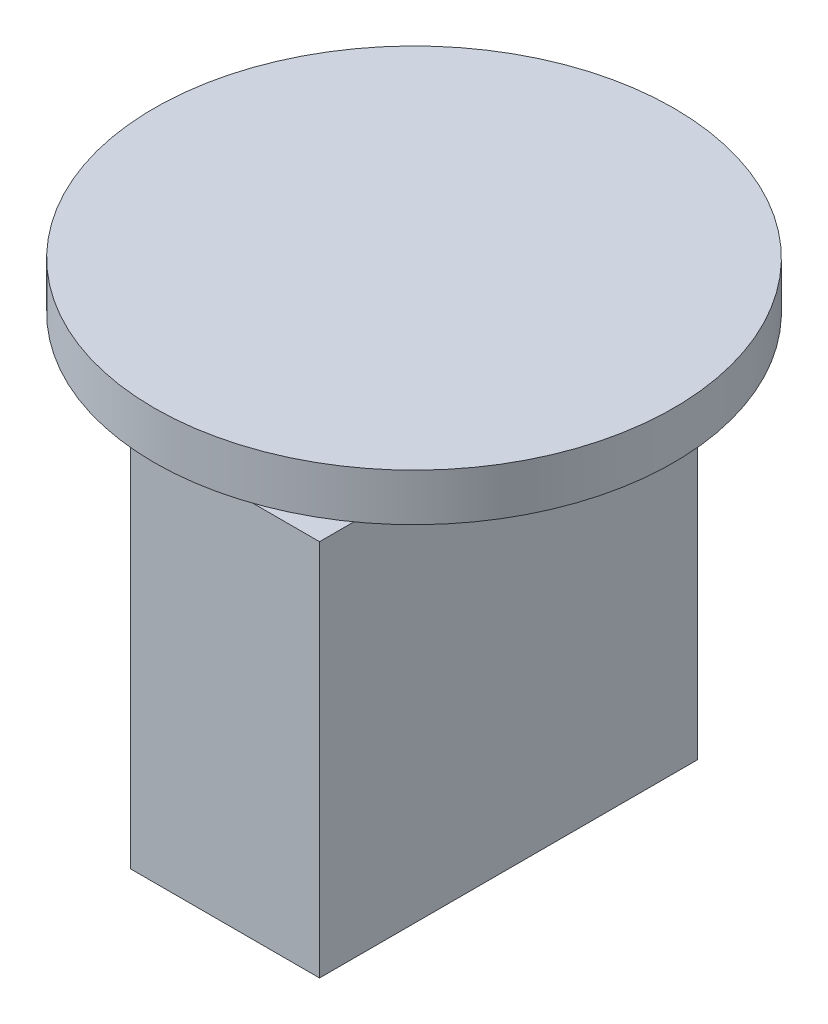
ISO-10303-21;
HEADER;
FILE_DESCRIPTION(('STEP AP214'),'2;1');
FILE_NAME('part.step','',(''),(''),'','','');
FILE_SCHEMA(('AUTOMOTIVE_DESIGN { 1 0 10303 214 1 1 1 1 }'));
ENDSEC;
DATA;
#1=APPLICATION_CONTEXT('core data for automotive mechanical design processes');
#2=APPLICATION_PROTOCOL_DEFINITION('international standard','automotive_design',2000,#1);
#3=PRODUCT_CONTEXT('',#1,'mechanical');
#4=PRODUCT('Part','Part','',(#3));
#5=PRODUCT_RELATED_PRODUCT_CATEGORY('part','',(#4));
#6=PRODUCT_DEFINITION_FORMATION('','',#4);
#7=PRODUCT_DEFINITION_CONTEXT('part definition',#1,'design');
#8=PRODUCT_DEFINITION('design','',#6,#7);
#9=PRODUCT_DEFINITION_SHAPE('','',#8);
#10=(LENGTH_UNIT() NAMED_UNIT(*) SI_UNIT(.MILLI.,.METRE.));
#11=(NAMED_UNIT(*) PLANE_ANGLE_UNIT() SI_UNIT($,.RADIAN.));
#12=(NAMED_UNIT(*) SI_UNIT($,.STERADIAN.) SOLID_ANGLE_UNIT());
#13=UNCERTAINTY_MEASURE_WITH_UNIT(LENGTH_MEASURE(1.E-05),#10,'distance_accuracy_value','');
#14=(GEOMETRIC_REPRESENTATION_CONTEXT(3) GLOBAL_UNCERTAINTY_ASSIGNED_CONTEXT((#13)) GLOBAL_UNIT_ASSIGNED_CONTEXT((#10,
#11,#12)) REPRESENTATION_CONTEXT('',''));
#15=CARTESIAN_POINT('',(0.,0.,0.));
#16=DIRECTION('',(0.,0.,1.));
#17=DIRECTION('',(1.,0.,0.));
#18=AXIS2_PLACEMENT_3D('',#15,#16,#17);
#19=CARTESIAN_POINT('',(0.,50.8,0.));
#20=DIRECTION('',(-1.,0.,0.));
#21=DIRECTION('',(0.,0.,1.));
#22=AXIS2_PLACEMENT_3D('',#19,#20,#21);
#23=PLANE('',#22);
#24=DIRECTION('',(0.,0.,-1.));
#25=VECTOR('',#24,1.);
#26=CARTESIAN_POINT('',(0.,0.,0.));
#27=LINE('',#26,#25);
#28=CARTESIAN_POINT('',(0.,0.,0.));
#29=VERTEX_POINT('',#28);
#30=CARTESIAN_POINT('',(0.,0.,-50.8));
#31=VERTEX_POINT('',#30);
#32=EDGE_CURVE('E102',#29,#31,#27,.T.);
#33=ORIENTED_EDGE('',*,*,#32,.T.);
#34=DIRECTION('',(0.,-1.,0.));
#35=VECTOR('',#34,1.);
#36=CARTESIAN_POINT('',(0.,50.8,-50.8));
#37=LINE('',#36,#35);
#38=CARTESIAN_POINT('',(0.,50.8,-50.8));
#39=VERTEX_POINT('',#38);
#40=EDGE_CURVE('E11',#39,#31,#37,.T.);
#41=ORIENTED_EDGE('',*,*,#40,.F.);
#42=DIRECTION('',(0.,0.,-1.));
#43=VECTOR('',#42,1.);
#44=CARTESIAN_POINT('',(0.,50.8,0.));
#45=LINE('',#44,#43);
#46=CARTESIAN_POINT('',(0.,50.8,0.));
#47=VERTEX_POINT('',#46);
#48=EDGE_CURVE('E90',#47,#39,#45,.T.);
#49=ORIENTED_EDGE('',*,*,#48,.F.);
#50=DIRECTION('',(0.,-1.,0.));
#51=VECTOR('',#50,1.);
#52=CARTESIAN_POINT('',(0.,50.8,0.));
#53=LINE('',#52,#51);
#54=EDGE_CURVE('E98',#47,#29,#53,.T.);
#55=ORIENTED_EDGE('',*,*,#54,.T.);
#56=EDGE_LOOP('',(#33,#41,#49,#55));
#57=FACE_BOUND('',#56,.T.);
#58=ADVANCED_FACE('F39',(#57),#23,.F.);
#59=CARTESIAN_POINT('',(0.,50.8,-50.8));
#60=DIRECTION('',(0.,0.,1.));
#61=DIRECTION('',(1.,0.,0.));
#62=AXIS2_PLACEMENT_3D('',#59,#60,#61);
#63=PLANE('',#62);
#64=DIRECTION('',(-1.,0.,0.));
#65=VECTOR('',#64,1.);
#66=CARTESIAN_POINT('',(0.,0.,-50.8));
#67=LINE('',#66,#65);
#68=CARTESIAN_POINT('',(-25.4,0.,-50.8));
#69=VERTEX_POINT('',#68);
#70=EDGE_CURVE('E94',#31,#69,#67,.T.);
#71=ORIENTED_EDGE('',*,*,#70,.T.);
#72=DIRECTION('',(0.,-1.,0.));
#73=VECTOR('',#72,1.);
#74=CARTESIAN_POINT('',(-25.4,50.8,-50.8));
#75=LINE('',#74,#73);
#76=CARTESIAN_POINT('',(-25.4,50.8,-50.8));
#77=VERTEX_POINT('',#76);
#78=EDGE_CURVE('E47',#77,#69,#75,.T.);
#79=ORIENTED_EDGE('',*,*,#78,.F.);
#80=DIRECTION('',(-1.,0.,0.));
#81=VECTOR('',#80,1.);
#82=CARTESIAN_POINT('',(0.,50.8,-50.8));
#83=LINE('',#82,#81);
#84=EDGE_CURVE('E85',#39,#77,#83,.T.);
#85=ORIENTED_EDGE('',*,*,#84,.F.);
#86=ORIENTED_EDGE('',*,*,#40,.T.);
#87=EDGE_LOOP('',(#71,#79,#85,#86));
#88=FACE_BOUND('',#87,.T.);
#89=ADVANCED_FACE('F93',(#88),#63,.F.);
#90=CARTESIAN_POINT('',(-25.4,50.8,0.));
#91=DIRECTION('',(1.,0.,0.));
#92=DIRECTION('',(0.,0.,-1.));
#93=AXIS2_PLACEMENT_3D('',#90,#91,#92);
#94=PLANE('',#93);
#95=DIRECTION('',(0.,0.,1.));
#96=VECTOR('',#95,1.);
#97=CARTESIAN_POINT('',(-25.4,0.,0.));
#98=LINE('',#97,#96);
#99=CARTESIAN_POINT('',(-25.4,0.,0.));
#100=VERTEX_POINT('',#99);
#101=EDGE_CURVE('E72',#69,#100,#98,.T.);
#102=ORIENTED_EDGE('',*,*,#101,.T.);
#103=DIRECTION('',(0.,-1.,0.));
#104=VECTOR('',#103,1.);
#105=CARTESIAN_POINT('',(-25.4,50.8,0.));
#106=LINE('',#105,#104);
#107=CARTESIAN_POINT('',(-25.4,50.8,0.));
#108=VERTEX_POINT('',#107);
#109=EDGE_CURVE('E95',#108,#100,#106,.T.);
#110=ORIENTED_EDGE('',*,*,#109,.F.);
#111=DIRECTION('',(0.,0.,1.));
#112=VECTOR('',#111,1.);
#113=CARTESIAN_POINT('',(-25.4,50.8,0.));
#114=LINE('',#113,#112);
#115=EDGE_CURVE('E88',#77,#108,#114,.T.);
#116=ORIENTED_EDGE('',*,*,#115,.F.);
#117=ORIENTED_EDGE('',*,*,#78,.T.);
#118=EDGE_LOOP('',(#102,#110,#116,#117));
#119=FACE_BOUND('',#118,.T.);
#120=ADVANCED_FACE('F96',(#119),#94,.F.);
#121=CARTESIAN_POINT('',(0.,50.8,0.));
#122=DIRECTION('',(0.,0.,-1.));
#123=DIRECTION('',(-1.,0.,0.));
#124=AXIS2_PLACEMENT_3D('',#121,#122,#123);
#125=PLANE('',#124);
#126=DIRECTION('',(1.,0.,0.));
#127=VECTOR('',#126,1.);
#128=CARTESIAN_POINT('',(0.,0.,0.));
#129=LINE('',#128,#127);
#130=EDGE_CURVE('E78',#100,#29,#129,.T.);
#131=ORIENTED_EDGE('',*,*,#130,.T.);
#132=ORIENTED_EDGE('',*,*,#54,.F.);
#133=DIRECTION('',(1.,0.,0.));
#134=VECTOR('',#133,1.);
#135=CARTESIAN_POINT('',(0.,50.8,0.));
#136=LINE('',#135,#134);
#137=EDGE_CURVE('E55',#108,#47,#136,.T.);
#138=ORIENTED_EDGE('',*,*,#137,.F.);
#139=ORIENTED_EDGE('',*,*,#109,.T.);
#140=EDGE_LOOP('',(#131,#132,#138,#139));
#141=FACE_BOUND('',#140,.T.);
#142=ADVANCED_FACE('F110',(#141),#125,.F.);
#143=CARTESIAN_POINT('',(0.,50.8,0.));
#144=DIRECTION('',(0.,1.,0.));
#145=DIRECTION('',(0.,0.,1.));
#146=AXIS2_PLACEMENT_3D('',#143,#144,#145);
#147=PLANE('',#146);
#148=CARTESIAN_POINT('',(-12.7,50.8,-25.4));
#149=DIRECTION('',(0.,1.,0.));
#150=DIRECTION('',(0.,0.,1.));
#151=AXIS2_PLACEMENT_3D('',#148,#149,#150);
#152=CIRCLE('',#151,2.54);
#153=CARTESIAN_POINT('',(-12.7,50.8,-27.94));
#154=VERTEX_POINT('',#153);
#155=EDGE_CURVE('E116',#154,#154,#152,.T.);
#156=ORIENTED_EDGE('',*,*,#155,.F.);
#157=EDGE_LOOP('',(#156));
#158=FACE_BOUND('',#157,.T.);
#159=ORIENTED_EDGE('',*,*,#48,.T.);
#160=ORIENTED_EDGE('',*,*,#84,.T.);
#161=ORIENTED_EDGE('',*,*,#115,.T.);
#162=ORIENTED_EDGE('',*,*,#137,.T.);
#163=EDGE_LOOP('',(#159,#160,#161,#162));
#164=FACE_BOUND('',#163,.T.);
#165=ADVANCED_FACE('F86',(#158,#164),#147,.T.);
#166=CARTESIAN_POINT('',(0.,0.,0.));
#167=DIRECTION('',(0.,1.,0.));
#168=DIRECTION('',(0.,0.,1.));
#169=AXIS2_PLACEMENT_3D('',#166,#167,#168);
#170=PLANE('',#169);
#171=ORIENTED_EDGE('',*,*,#32,.F.);
#172=ORIENTED_EDGE('',*,*,#130,.F.);
#173=ORIENTED_EDGE('',*,*,#101,.F.);
#174=ORIENTED_EDGE('',*,*,#70,.F.);
#175=EDGE_LOOP('',(#171,#172,#173,#174));
#176=FACE_BOUND('',#175,.T.);
#177=ADVANCED_FACE('F113',(#176),#170,.F.);
#178=CARTESIAN_POINT('',(-12.7,58.42,-25.4));
#179=DIRECTION('',(0.,-1.,0.));
#180=DIRECTION('',(0.,0.,-1.));
#181=AXIS2_PLACEMENT_3D('',#178,#179,#180);
#182=CYLINDRICAL_SURFACE('',#181,2.54);
#183=CARTESIAN_POINT('',(-12.7,58.42,-25.4));
#184=DIRECTION('',(0.,1.,0.));
#185=DIRECTION('',(0.,0.,1.));
#186=AXIS2_PLACEMENT_3D('',#183,#184,#185);
#187=CIRCLE('',#186,2.54);
#188=CARTESIAN_POINT('',(-12.7,58.42,-27.94));
#189=VERTEX_POINT('',#188);
#190=EDGE_CURVE('E105',#189,#189,#187,.T.);
#191=CARTESIAN_POINT('',(-12.7,58.42,-27.94));
#192=CARTESIAN_POINT('',(-12.7,58.340625,-27.94));
#193=CARTESIAN_POINT('',(-12.7,58.26125,-27.94));
#194=CARTESIAN_POINT('',(-12.7,58.1025,-27.94));
#195=CARTESIAN_POINT('',(-12.7,58.023125,-27.94));
#196=CARTESIAN_POINT('',(-12.7,57.864375,-27.94));
#197=CARTESIAN_POINT('',(-12.7,57.785,-27.94));
#198=CARTESIAN_POINT('',(-12.7,57.62625,-27.94));
#199=CARTESIAN_POINT('',(-12.7,57.546875,-27.94));
#200=CARTESIAN_POINT('',(-12.7,57.388125,-27.94));
#201=CARTESIAN_POINT('',(-12.7,57.30875,-27.94));
#202=CARTESIAN_POINT('',(-12.7,57.15,-27.94));
#203=CARTESIAN_POINT('',(-12.7,57.070625,-27.94));
#204=CARTESIAN_POINT('',(-12.7,56.911875,-27.94));
#205=CARTESIAN_POINT('',(-12.7,56.8325,-27.94));
#206=CARTESIAN_POINT('',(-12.7,56.67375,-27.94));
#207=CARTESIAN_POINT('',(-12.7,56.594375,-27.94));
#208=CARTESIAN_POINT('',(-12.7,56.435625,-27.94));
#209=CARTESIAN_POINT('',(-12.7,56.35625,-27.94));
#210=CARTESIAN_POINT('',(-12.7,56.1975,-27.94));
#211=CARTESIAN_POINT('',(-12.7,56.118125,-27.94));
#212=CARTESIAN_POINT('',(-12.7,55.959375,-27.94));
#213=CARTESIAN_POINT('',(-12.7,55.88,-27.94));
#214=CARTESIAN_POINT('',(-12.7,55.72125,-27.94));
#215=CARTESIAN_POINT('',(-12.7,55.641875,-27.94));
#216=CARTESIAN_POINT('',(-12.7,55.483125,-27.94));
#217=CARTESIAN_POINT('',(-12.7,55.40375,-27.94));
#218=CARTESIAN_POINT('',(-12.7,55.245,-27.94));
#219=CARTESIAN_POINT('',(-12.7,55.165625,-27.94));
#220=CARTESIAN_POINT('',(-12.7,55.006875,-27.94));
#221=CARTESIAN_POINT('',(-12.7,54.9275,-27.94));
#222=CARTESIAN_POINT('',(-12.7,54.76875,-27.94));
#223=CARTESIAN_POINT('',(-12.7,54.689375,-27.94));
#224=CARTESIAN_POINT('',(-12.7,54.530625,-27.94));
#225=CARTESIAN_POINT('',(-12.7,54.45125,-27.94));
#226=CARTESIAN_POINT('',(-12.7,54.2925,-27.94));
#227=CARTESIAN_POINT('',(-12.7,54.213125,-27.94));
#228=CARTESIAN_POINT('',(-12.7,54.054375,-27.94));
#229=CARTESIAN_POINT('',(-12.7,53.975,-27.94));
#230=CARTESIAN_POINT('',(-12.7,53.81625,-27.94));
#231=CARTESIAN_POINT('',(-12.7,53.736875,-27.94));
#232=CARTESIAN_POINT('',(-12.7,53.578125,-27.94));
#233=CARTESIAN_POINT('',(-12.7,53.49875,-27.94));
#234=CARTESIAN_POINT('',(-12.7,53.34,-27.94));
#235=CARTESIAN_POINT('',(-12.7,53.260625,-27.94));
#236=CARTESIAN_POINT('',(-12.7,53.101875,-27.94));
#237=CARTESIAN_POINT('',(-12.7,53.0225,-27.94));
#238=CARTESIAN_POINT('',(-12.7,52.86375,-27.94));
#239=CARTESIAN_POINT('',(-12.7,52.784375,-27.94));
#240=CARTESIAN_POINT('',(-12.7,52.625625,-27.94));
#241=CARTESIAN_POINT('',(-12.7,52.54625,-27.94));
#242=CARTESIAN_POINT('',(-12.7,52.3875,-27.94));
#243=CARTESIAN_POINT('',(-12.7,52.308125,-27.94));
#244=CARTESIAN_POINT('',(-12.7,52.149375,-27.94));
#245=CARTESIAN_POINT('',(-12.7,52.07,-27.94));
#246=CARTESIAN_POINT('',(-12.7,51.91125,-27.94));
#247=CARTESIAN_POINT('',(-12.7,51.831875,-27.94));
#248=CARTESIAN_POINT('',(-12.7,51.673125,-27.94));
#249=CARTESIAN_POINT('',(-12.7,51.59375,-27.94));
#250=CARTESIAN_POINT('',(-12.7,51.435,-27.94));
#251=CARTESIAN_POINT('',(-12.7,51.355625,-27.94));
#252=CARTESIAN_POINT('',(-12.7,51.196875,-27.94));
#253=CARTESIAN_POINT('',(-12.7,51.1175,-27.94));
#254=CARTESIAN_POINT('',(-12.7,50.95875,-27.94));
#255=CARTESIAN_POINT('',(-12.7,50.879375,-27.94));
#256=CARTESIAN_POINT('',(-12.7,50.8,-27.94));
#257=B_SPLINE_CURVE_WITH_KNOTS('',3,(#191,#192,#193,#194,#195,#196,#197,#198,#199,#200,#201,
#202,#203,#204,#205,#206,#207,#208,#209,#210,#211,#212,#213,#214,#215,#216,#217,#218,#219,#220,
#221,#222,#223,#224,#225,#226,#227,#228,#229,#230,#231,#232,#233,#234,#235,#236,#237,#238,#239,
#240,#241,#242,#243,#244,#245,#246,#247,#248,#249,#250,#251,#252,#253,#254,#255,#256),
.UNSPECIFIED.,.F.,.F.,(4,2,2,2,2,2,2,2,2,2,2,2,2,2,2,2,2,2,2,2,2,2,2,2,2,2,2,2,2,2,2,2,4),(0.,
0.238124999999999,0.476249999999998,0.714374999999996,0.952499999999995,1.19062499999999,
1.42875,1.666875,1.905,2.143125,2.38124999999999,2.619375,2.8575,3.095625,3.33375,3.571875,3.81,
4.048125,4.28625,4.524375,4.7625,5.000625,5.23875,5.476875,5.715,5.953125,6.19125,6.429375,
6.6675,6.905625,7.14375,7.381875,7.62),.UNSPECIFIED.);
#258=EDGE_CURVE('BSEAM133',#189,#154,#257,.T.);
#259=ORIENTED_EDGE('',*,*,#190,.F.);
#260=ORIENTED_EDGE('',*,*,#155,.T.);
#261=ORIENTED_EDGE('',*,*,#258,.T.);
#262=ORIENTED_EDGE('',*,*,#258,.F.);
#263=EDGE_LOOP('',(#259,#261,#260,#262));
#264=FACE_BOUND('',#263,.T.);
#265=ADVANCED_FACE('F133',(#264),#182,.T.);
#266=CARTESIAN_POINT('',(-12.7,64.77,-25.4));
#267=DIRECTION('',(0.,-1.,0.));
#268=DIRECTION('',(0.,0.,-1.));
#269=AXIS2_PLACEMENT_3D('',#266,#267,#268);
#270=CYLINDRICAL_SURFACE('',#269,34.925);
#271=CARTESIAN_POINT('',(-12.7,64.77,-25.4));
#272=DIRECTION('',(0.,1.,0.));
#273=DIRECTION('',(0.,0.,1.));
#274=AXIS2_PLACEMENT_3D('',#271,#272,#273);
#275=CIRCLE('',#274,34.925);
#276=CARTESIAN_POINT('',(-12.7,64.77,9.525));
#277=VERTEX_POINT('',#276);
#278=EDGE_CURVE('E119',#277,#277,#275,.T.);
#279=ORIENTED_EDGE('',*,*,#278,.F.);
#280=EDGE_LOOP('',(#279));
#281=FACE_BOUND('',#280,.T.);
#282=CARTESIAN_POINT('',(-12.7,58.42,-25.4));
#283=DIRECTION('',(0.,1.,0.));
#284=DIRECTION('',(0.,0.,1.));
#285=AXIS2_PLACEMENT_3D('',#282,#283,#284);
#286=CIRCLE('',#285,34.925);
#287=CARTESIAN_POINT('',(-12.7,58.42,9.525));
#288=VERTEX_POINT('',#287);
#289=EDGE_CURVE('E122',#288,#288,#286,.T.);
#290=ORIENTED_EDGE('',*,*,#289,.T.);
#291=EDGE_LOOP('',(#290));
#292=FACE_BOUND('',#291,.T.);
#293=ADVANCED_FACE('F130',(#281,#292),#270,.T.);
#294=CARTESIAN_POINT('',(-12.7,64.77,-25.4));
#295=DIRECTION('',(0.,1.,0.));
#296=DIRECTION('',(0.,0.,1.));
#297=AXIS2_PLACEMENT_3D('',#294,#295,#296);
#298=PLANE('',#297);
#299=ORIENTED_EDGE('',*,*,#278,.T.);
#300=EDGE_LOOP('',(#299));
#301=FACE_BOUND('',#300,.T.);
#302=ADVANCED_FACE('F128',(#301),#298,.T.);
#303=CARTESIAN_POINT('',(-12.7,58.42,-25.4));
#304=DIRECTION('',(0.,1.,0.));
#305=DIRECTION('',(0.,0.,1.));
#306=AXIS2_PLACEMENT_3D('',#303,#304,#305);
#307=PLANE('',#306);
#308=ORIENTED_EDGE('',*,*,#190,.T.);
#309=EDGE_LOOP('',(#308));
#310=FACE_BOUND('',#309,.T.);
#311=ORIENTED_EDGE('',*,*,#289,.F.);
#312=EDGE_LOOP('',(#311));
#313=FACE_BOUND('',#312,.T.);
#314=ADVANCED_FACE('F137',(#310,#313),#307,.F.);
#315=CLOSED_SHELL('',(#58,#89,#120,#142,#165,#177,#265,#293,#302,#314));
#316=MANIFOLD_SOLID_BREP('B2',#315);
#317=ADVANCED_BREP_SHAPE_REPRESENTATION('',(#18,#316),#14);
#318=SHAPE_DEFINITION_REPRESENTATION(#9,#317);
ENDSEC;
END-ISO-10303-21;
